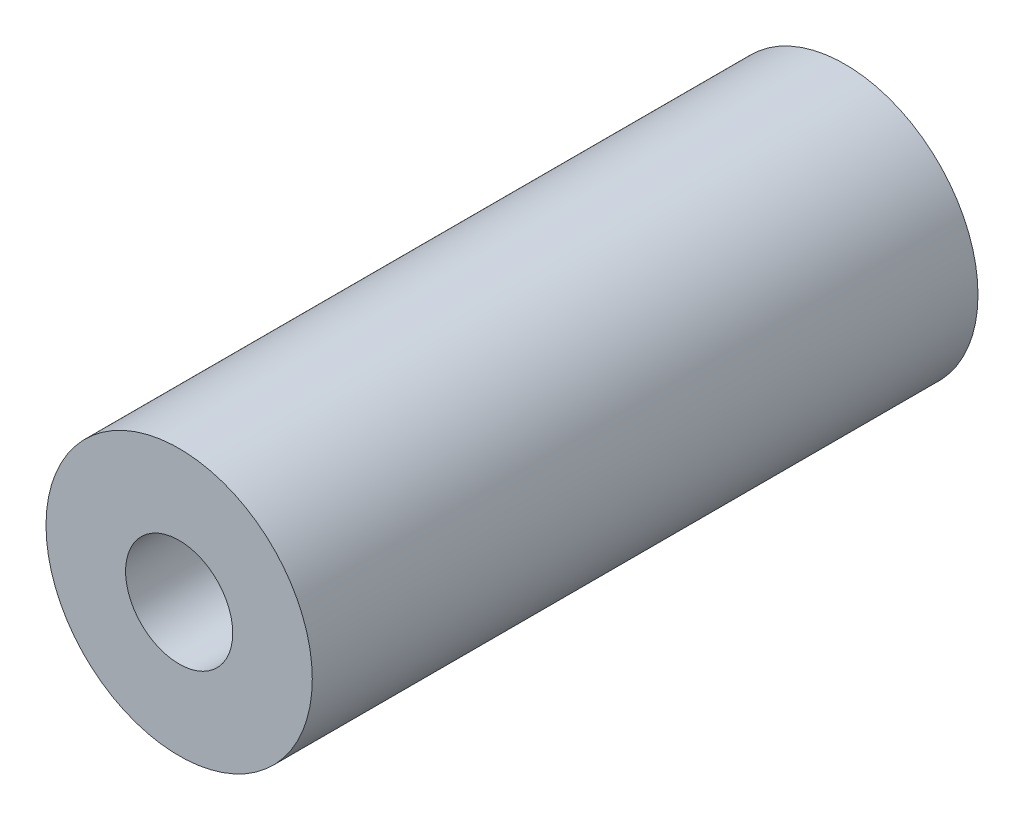
ISO-10303-21;
HEADER;
FILE_DESCRIPTION(('STEP AP214'),'2;1');
FILE_NAME('part.step','',(''),(''),'','','');
FILE_SCHEMA(('AUTOMOTIVE_DESIGN { 1 0 10303 214 1 1 1 1 }'));
ENDSEC;
DATA;
#1=APPLICATION_CONTEXT('core data for automotive mechanical design processes');
#2=APPLICATION_PROTOCOL_DEFINITION('international standard','automotive_design',2000,#1);
#3=PRODUCT_CONTEXT('',#1,'mechanical');
#4=PRODUCT('Part','Part','',(#3));
#5=PRODUCT_RELATED_PRODUCT_CATEGORY('part','',(#4));
#6=PRODUCT_DEFINITION_FORMATION('','',#4);
#7=PRODUCT_DEFINITION_CONTEXT('part definition',#1,'design');
#8=PRODUCT_DEFINITION('design','',#6,#7);
#9=PRODUCT_DEFINITION_SHAPE('','',#8);
#10=(LENGTH_UNIT() NAMED_UNIT(*) SI_UNIT(.MILLI.,.METRE.));
#11=(NAMED_UNIT(*) PLANE_ANGLE_UNIT() SI_UNIT($,.RADIAN.));
#12=(NAMED_UNIT(*) SI_UNIT($,.STERADIAN.) SOLID_ANGLE_UNIT());
#13=UNCERTAINTY_MEASURE_WITH_UNIT(LENGTH_MEASURE(1.E-05),#10,'distance_accuracy_value','');
#14=(GEOMETRIC_REPRESENTATION_CONTEXT(3) GLOBAL_UNCERTAINTY_ASSIGNED_CONTEXT((#13)) GLOBAL_UNIT_ASSIGNED_CONTEXT((#10,
#11,#12)) REPRESENTATION_CONTEXT('',''));
#15=CARTESIAN_POINT('',(0.,0.,0.));
#16=DIRECTION('',(0.,0.,1.));
#17=DIRECTION('',(1.,0.,0.));
#18=AXIS2_PLACEMENT_3D('',#15,#16,#17);
#19=CARTESIAN_POINT('',(0.,0.,31.75));
#20=DIRECTION('',(0.,0.,1.));
#21=DIRECTION('',(1.,0.,0.));
#22=AXIS2_PLACEMENT_3D('',#19,#20,#21);
#23=PLANE('',#22);
#24=CARTESIAN_POINT('',(0.,0.,31.75));
#25=DIRECTION('',(0.,0.,1.));
#26=DIRECTION('',(1.,0.,0.));
#27=AXIS2_PLACEMENT_3D('',#24,#25,#26);
#28=CIRCLE('',#27,6.35);
#29=CARTESIAN_POINT('',(6.35,0.,31.75));
#30=VERTEX_POINT('',#29);
#31=EDGE_CURVE('E10',#30,#30,#28,.T.);
#32=ORIENTED_EDGE('',*,*,#31,.T.);
#33=EDGE_LOOP('',(#32));
#34=FACE_BOUND('',#33,.T.);
#35=CARTESIAN_POINT('',(0.,0.,31.75));
#36=DIRECTION('',(0.,0.,1.));
#37=DIRECTION('',(1.,0.,0.));
#38=AXIS2_PLACEMENT_3D('',#35,#36,#37);
#39=CIRCLE('',#38,2.555);
#40=CARTESIAN_POINT('',(2.555,0.,31.75));
#41=VERTEX_POINT('',#40);
#42=EDGE_CURVE('E54',#41,#41,#39,.T.);
#43=ORIENTED_EDGE('',*,*,#42,.F.);
#44=EDGE_LOOP('',(#43));
#45=FACE_BOUND('',#44,.T.);
#46=ADVANCED_FACE('F41',(#34,#45),#23,.T.);
#47=CARTESIAN_POINT('',(0.,0.,0.));
#48=DIRECTION('',(0.,0.,1.));
#49=DIRECTION('',(1.,0.,0.));
#50=AXIS2_PLACEMENT_3D('',#47,#48,#49);
#51=PLANE('',#50);
#52=CARTESIAN_POINT('',(0.,0.,0.));
#53=DIRECTION('',(0.,0.,1.));
#54=DIRECTION('',(1.,0.,0.));
#55=AXIS2_PLACEMENT_3D('',#52,#53,#54);
#56=CIRCLE('',#55,6.35);
#57=CARTESIAN_POINT('',(6.35,0.,0.));
#58=VERTEX_POINT('',#57);
#59=EDGE_CURVE('E45',#58,#58,#56,.T.);
#60=ORIENTED_EDGE('',*,*,#59,.F.);
#61=EDGE_LOOP('',(#60));
#62=FACE_BOUND('',#61,.T.);
#63=CARTESIAN_POINT('',(0.,0.,0.));
#64=DIRECTION('',(0.,0.,1.));
#65=DIRECTION('',(1.,0.,0.));
#66=AXIS2_PLACEMENT_3D('',#63,#64,#65);
#67=CIRCLE('',#66,2.555);
#68=CARTESIAN_POINT('',(2.555,0.,0.));
#69=VERTEX_POINT('',#68);
#70=EDGE_CURVE('E56',#69,#69,#67,.T.);
#71=ORIENTED_EDGE('',*,*,#70,.T.);
#72=EDGE_LOOP('',(#71));
#73=FACE_BOUND('',#72,.T.);
#74=ADVANCED_FACE('F68',(#62,#73),#51,.F.);
#75=CARTESIAN_POINT('',(0.,0.,31.75));
#76=DIRECTION('',(0.,0.,-1.));
#77=DIRECTION('',(-1.,0.,0.));
#78=AXIS2_PLACEMENT_3D('',#75,#76,#77);
#79=CYLINDRICAL_SURFACE('',#78,6.35);
#80=ORIENTED_EDGE('',*,*,#31,.F.);
#81=EDGE_LOOP('',(#80));
#82=FACE_BOUND('',#81,.T.);
#83=ORIENTED_EDGE('',*,*,#59,.T.);
#84=EDGE_LOOP('',(#83));
#85=FACE_BOUND('',#84,.T.);
#86=ADVANCED_FACE('F43',(#82,#85),#79,.T.);
#87=CARTESIAN_POINT('',(0.,0.,31.75));
#88=DIRECTION('',(0.,0.,-1.));
#89=DIRECTION('',(-1.,0.,0.));
#90=AXIS2_PLACEMENT_3D('',#87,#88,#89);
#91=CYLINDRICAL_SURFACE('',#90,2.555);
#92=ORIENTED_EDGE('',*,*,#42,.T.);
#93=EDGE_LOOP('',(#92));
#94=FACE_BOUND('',#93,.T.);
#95=ORIENTED_EDGE('',*,*,#70,.F.);
#96=EDGE_LOOP('',(#95));
#97=FACE_BOUND('',#96,.T.);
#98=ADVANCED_FACE('F64',(#94,#97),#91,.F.);
#99=CLOSED_SHELL('',(#46,#74,#86,#98));
#100=MANIFOLD_SOLID_BREP('B2',#99);
#101=ADVANCED_BREP_SHAPE_REPRESENTATION('',(#18,#100),#14);
#102=SHAPE_DEFINITION_REPRESENTATION(#9,#101);
ENDSEC;
END-ISO-10303-21;
